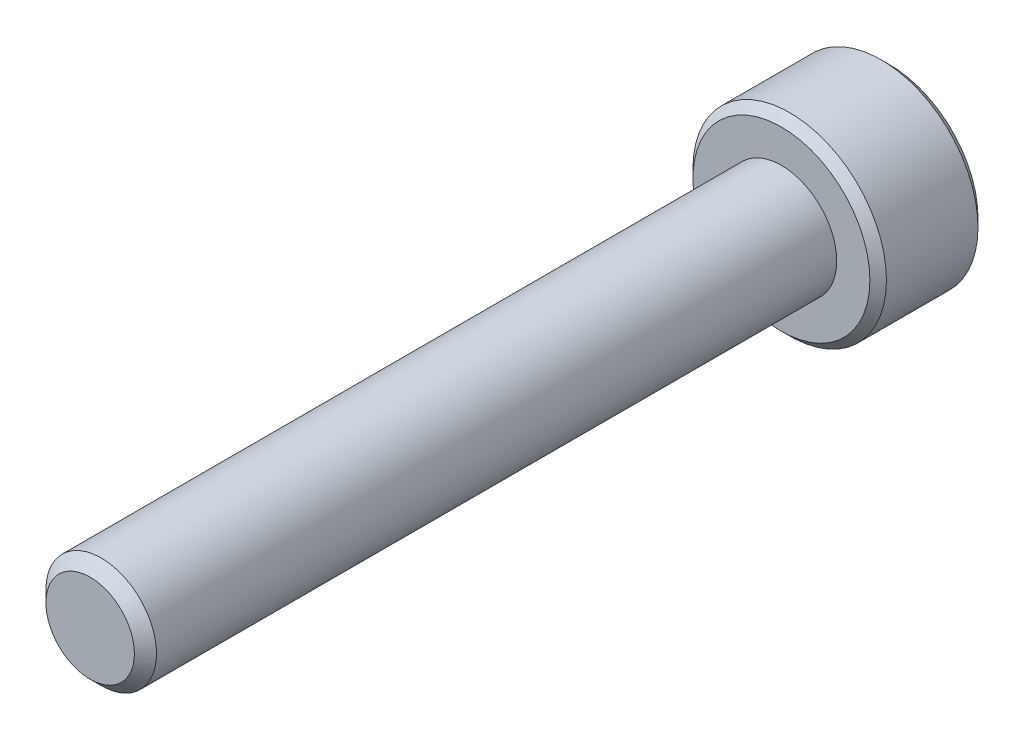
ISO-10303-21;
HEADER;
FILE_DESCRIPTION(('STEP AP214'),'2;1');
FILE_NAME('part.step','',(''),(''),'','','');
FILE_SCHEMA(('AUTOMOTIVE_DESIGN { 1 0 10303 214 1 1 1 1 }'));
ENDSEC;
DATA;
#1=APPLICATION_CONTEXT('core data for automotive mechanical design processes');
#2=APPLICATION_PROTOCOL_DEFINITION('international standard','automotive_design',2000,#1);
#3=PRODUCT_CONTEXT('',#1,'mechanical');
#4=PRODUCT('Part','Part','',(#3));
#5=PRODUCT_RELATED_PRODUCT_CATEGORY('part','',(#4));
#6=PRODUCT_DEFINITION_FORMATION('','',#4);
#7=PRODUCT_DEFINITION_CONTEXT('part definition',#1,'design');
#8=PRODUCT_DEFINITION('design','',#6,#7);
#9=PRODUCT_DEFINITION_SHAPE('','',#8);
#10=(LENGTH_UNIT() NAMED_UNIT(*) SI_UNIT(.MILLI.,.METRE.));
#11=(NAMED_UNIT(*) PLANE_ANGLE_UNIT() SI_UNIT($,.RADIAN.));
#12=(NAMED_UNIT(*) SI_UNIT($,.STERADIAN.) SOLID_ANGLE_UNIT());
#13=UNCERTAINTY_MEASURE_WITH_UNIT(LENGTH_MEASURE(1.E-05),#10,'distance_accuracy_value','');
#14=(GEOMETRIC_REPRESENTATION_CONTEXT(3) GLOBAL_UNCERTAINTY_ASSIGNED_CONTEXT((#13)) GLOBAL_UNIT_ASSIGNED_CONTEXT((#10,
#11,#12)) REPRESENTATION_CONTEXT('',''));
#15=CARTESIAN_POINT('',(0.,0.,0.));
#16=DIRECTION('',(0.,0.,1.));
#17=DIRECTION('',(1.,0.,0.));
#18=AXIS2_PLACEMENT_3D('',#15,#16,#17);
#19=CARTESIAN_POINT('',(0.,0.,3.91));
#20=DIRECTION('',(0.,0.,-1.));
#21=DIRECTION('',(-1.,0.,0.));
#22=AXIS2_PLACEMENT_3D('',#19,#20,#21);
#23=CYLINDRICAL_SURFACE('',#22,3.5);
#24=CARTESIAN_POINT('',(0.,0.,3.61));
#25=DIRECTION('',(0.,0.,1.));
#26=DIRECTION('',(1.,0.,0.));
#27=AXIS2_PLACEMENT_3D('',#24,#25,#26);
#28=CIRCLE('',#27,3.5);
#29=CARTESIAN_POINT('',(3.5,0.,3.61));
#30=VERTEX_POINT('',#29);
#31=EDGE_CURVE('E46',#30,#30,#28,.F.);
#32=ORIENTED_EDGE('',*,*,#31,.T.);
#33=EDGE_LOOP('',(#32));
#34=FACE_BOUND('',#33,.T.);
#35=CARTESIAN_POINT('',(0.,0.,0.299999999999997));
#36=DIRECTION('',(0.,0.,1.));
#37=DIRECTION('',(1.,0.,0.));
#38=AXIS2_PLACEMENT_3D('',#35,#36,#37);
#39=CIRCLE('',#38,3.5);
#40=CARTESIAN_POINT('',(3.5,0.,0.299999999999997));
#41=VERTEX_POINT('',#40);
#42=EDGE_CURVE('E157',#41,#41,#39,.T.);
#43=ORIENTED_EDGE('',*,*,#42,.T.);
#44=EDGE_LOOP('',(#43));
#45=FACE_BOUND('',#44,.T.);
#46=ADVANCED_FACE('F37',(#34,#45),#23,.T.);
#47=CARTESIAN_POINT('',(0.,0.,3.91));
#48=DIRECTION('',(0.,0.,1.));
#49=DIRECTION('',(1.,0.,0.));
#50=AXIS2_PLACEMENT_3D('',#47,#48,#49);
#51=PLANE('',#50);
#52=CARTESIAN_POINT('',(0.,0.,3.91));
#53=DIRECTION('',(0.,0.,1.));
#54=DIRECTION('',(1.,0.,0.));
#55=AXIS2_PLACEMENT_3D('',#52,#53,#54);
#56=CIRCLE('',#55,3.2);
#57=CARTESIAN_POINT('',(3.2,0.,3.91));
#58=VERTEX_POINT('',#57);
#59=EDGE_CURVE('E154',#58,#58,#56,.T.);
#60=ORIENTED_EDGE('',*,*,#59,.T.);
#61=EDGE_LOOP('',(#60));
#62=FACE_BOUND('',#61,.T.);
#63=CARTESIAN_POINT('',(0.,0.,3.91));
#64=DIRECTION('',(0.,0.,1.));
#65=DIRECTION('',(1.,0.,0.));
#66=AXIS2_PLACEMENT_3D('',#63,#64,#65);
#67=CIRCLE('',#66,2.);
#68=CARTESIAN_POINT('',(2.,0.,3.91));
#69=VERTEX_POINT('',#68);
#70=EDGE_CURVE('E140',#69,#69,#67,.T.);
#71=ORIENTED_EDGE('',*,*,#70,.F.);
#72=EDGE_LOOP('',(#71));
#73=FACE_BOUND('',#72,.T.);
#74=ADVANCED_FACE('F170',(#62,#73),#51,.T.);
#75=CARTESIAN_POINT('',(0.,0.,0.));
#76=DIRECTION('',(0.,0.,1.));
#77=DIRECTION('',(1.,0.,0.));
#78=AXIS2_PLACEMENT_3D('',#75,#76,#77);
#79=PLANE('',#78);
#80=CARTESIAN_POINT('',(0.,0.,0.));
#81=DIRECTION('',(0.,0.,1.));
#82=DIRECTION('',(1.,0.,0.));
#83=AXIS2_PLACEMENT_3D('',#80,#81,#82);
#84=CIRCLE('',#83,3.2);
#85=CARTESIAN_POINT('',(3.2,0.,0.));
#86=VERTEX_POINT('',#85);
#87=EDGE_CURVE('E11',#86,#86,#84,.F.);
#88=ORIENTED_EDGE('',*,*,#87,.T.);
#89=EDGE_LOOP('',(#88));
#90=FACE_BOUND('',#89,.T.);
#91=DIRECTION('',(0.866025403784439,-0.5,0.));
#92=VECTOR('',#91,1.);
#93=CARTESIAN_POINT('',(0.,1.76091832102836,0.));
#94=LINE('',#93,#92);
#95=CARTESIAN_POINT('',(0.,1.76091832102836,0.));
#96=VERTEX_POINT('',#95);
#97=CARTESIAN_POINT('',(1.525,0.88045916051418,0.));
#98=VERTEX_POINT('',#97);
#99=EDGE_CURVE('E127',#96,#98,#94,.T.);
#100=ORIENTED_EDGE('',*,*,#99,.F.);
#101=DIRECTION('',(0.866025403784439,0.5,0.));
#102=VECTOR('',#101,1.);
#103=CARTESIAN_POINT('',(-1.525,0.880459160514179,0.));
#104=LINE('',#103,#102);
#105=CARTESIAN_POINT('',(-1.525,0.880459160514179,0.));
#106=VERTEX_POINT('',#105);
#107=EDGE_CURVE('E53',#106,#96,#104,.T.);
#108=ORIENTED_EDGE('',*,*,#107,.F.);
#109=DIRECTION('',(0.,1.,0.));
#110=VECTOR('',#109,1.);
#111=CARTESIAN_POINT('',(-1.525,-0.88045916051418,0.));
#112=LINE('',#111,#110);
#113=CARTESIAN_POINT('',(-1.525,-0.88045916051418,0.));
#114=VERTEX_POINT('',#113);
#115=EDGE_CURVE('E136',#114,#106,#112,.T.);
#116=ORIENTED_EDGE('',*,*,#115,.F.);
#117=DIRECTION('',(-0.866025403784439,0.5,0.));
#118=VECTOR('',#117,1.);
#119=CARTESIAN_POINT('',(0.,-1.76091832102836,0.));
#120=LINE('',#119,#118);
#121=CARTESIAN_POINT('',(0.,-1.76091832102836,0.));
#122=VERTEX_POINT('',#121);
#123=EDGE_CURVE('E134',#122,#114,#120,.T.);
#124=ORIENTED_EDGE('',*,*,#123,.F.);
#125=DIRECTION('',(-0.866025403784438,-0.5,0.));
#126=VECTOR('',#125,1.);
#127=CARTESIAN_POINT('',(1.525,-0.880459160514179,0.));
#128=LINE('',#127,#126);
#129=CARTESIAN_POINT('',(1.525,-0.880459160514179,0.));
#130=VERTEX_POINT('',#129);
#131=EDGE_CURVE('E101',#130,#122,#128,.T.);
#132=ORIENTED_EDGE('',*,*,#131,.F.);
#133=DIRECTION('',(0.,-1.,0.));
#134=VECTOR('',#133,1.);
#135=CARTESIAN_POINT('',(1.525,0.88045916051418,0.));
#136=LINE('',#135,#134);
#137=EDGE_CURVE('E130',#98,#130,#136,.T.);
#138=ORIENTED_EDGE('',*,*,#137,.F.);
#139=EDGE_LOOP('',(#100,#108,#116,#124,#132,#138));
#140=FACE_BOUND('',#139,.T.);
#141=ADVANCED_FACE('F173',(#90,#140),#79,.F.);
#142=CARTESIAN_POINT('',(0.,0.,28.91));
#143=DIRECTION('',(0.,0.,-1.));
#144=DIRECTION('',(-1.,0.,0.));
#145=AXIS2_PLACEMENT_3D('',#142,#143,#144);
#146=CYLINDRICAL_SURFACE('',#145,2.);
#147=CARTESIAN_POINT('',(0.,0.,28.51));
#148=DIRECTION('',(0.,0.,1.));
#149=DIRECTION('',(1.,0.,0.));
#150=AXIS2_PLACEMENT_3D('',#147,#148,#149);
#151=CIRCLE('',#150,2.);
#152=CARTESIAN_POINT('',(2.,0.,28.51));
#153=VERTEX_POINT('',#152);
#154=EDGE_CURVE('E151',#153,#153,#151,.F.);
#155=ORIENTED_EDGE('',*,*,#154,.T.);
#156=EDGE_LOOP('',(#155));
#157=FACE_BOUND('',#156,.T.);
#158=ORIENTED_EDGE('',*,*,#70,.T.);
#159=EDGE_LOOP('',(#158));
#160=FACE_BOUND('',#159,.T.);
#161=ADVANCED_FACE('F177',(#157,#160),#146,.T.);
#162=CARTESIAN_POINT('',(0.,0.,28.91));
#163=DIRECTION('',(0.,0.,1.));
#164=DIRECTION('',(1.,0.,0.));
#165=AXIS2_PLACEMENT_3D('',#162,#163,#164);
#166=PLANE('',#165);
#167=CARTESIAN_POINT('',(0.,0.,28.91));
#168=DIRECTION('',(0.,0.,1.));
#169=DIRECTION('',(1.,0.,0.));
#170=AXIS2_PLACEMENT_3D('',#167,#168,#169);
#171=CIRCLE('',#170,1.6);
#172=CARTESIAN_POINT('',(1.6,0.,28.91));
#173=VERTEX_POINT('',#172);
#174=EDGE_CURVE('E148',#173,#173,#171,.T.);
#175=ORIENTED_EDGE('',*,*,#174,.T.);
#176=EDGE_LOOP('',(#175));
#177=FACE_BOUND('',#176,.T.);
#178=ADVANCED_FACE('F179',(#177),#166,.T.);
#179=CARTESIAN_POINT('',(-1.525,0.880459160514179,2.));
#180=DIRECTION('',(-0.5,0.866025403784439,0.));
#181=DIRECTION('',(-0.866025403784439,-0.5,0.));
#182=AXIS2_PLACEMENT_3D('',#179,#180,#181);
#183=PLANE('',#182);
#184=ORIENTED_EDGE('',*,*,#107,.T.);
#185=DIRECTION('',(0.,0.,-1.));
#186=VECTOR('',#185,1.);
#187=CARTESIAN_POINT('',(0.,1.76091832102836,2.));
#188=LINE('',#187,#186);
#189=CARTESIAN_POINT('',(0.,1.76091832102836,2.));
#190=VERTEX_POINT('',#189);
#191=EDGE_CURVE('E83',#190,#96,#188,.T.);
#192=ORIENTED_EDGE('',*,*,#191,.F.);
#193=DIRECTION('',(0.866025403784439,0.5,0.));
#194=VECTOR('',#193,1.);
#195=CARTESIAN_POINT('',(-1.525,0.880459160514179,2.));
#196=LINE('',#195,#194);
#197=CARTESIAN_POINT('',(-1.525,0.880459160514179,2.));
#198=VERTEX_POINT('',#197);
#199=EDGE_CURVE('E138',#198,#190,#196,.T.);
#200=ORIENTED_EDGE('',*,*,#199,.F.);
#201=DIRECTION('',(0.,0.,-1.));
#202=VECTOR('',#201,1.);
#203=CARTESIAN_POINT('',(-1.525,0.880459160514179,2.));
#204=LINE('',#203,#202);
#205=EDGE_CURVE('E61',#198,#106,#204,.T.);
#206=ORIENTED_EDGE('',*,*,#205,.T.);
#207=EDGE_LOOP('',(#184,#192,#200,#206));
#208=FACE_BOUND('',#207,.T.);
#209=ADVANCED_FACE('F186',(#208),#183,.F.);
#210=CARTESIAN_POINT('',(-1.525,-0.88045916051418,2.));
#211=DIRECTION('',(-1.,0.,0.));
#212=DIRECTION('',(0.,0.,1.));
#213=AXIS2_PLACEMENT_3D('',#210,#211,#212);
#214=PLANE('',#213);
#215=ORIENTED_EDGE('',*,*,#115,.T.);
#216=ORIENTED_EDGE('',*,*,#205,.F.);
#217=DIRECTION('',(0.,1.,0.));
#218=VECTOR('',#217,1.);
#219=CARTESIAN_POINT('',(-1.525,-0.88045916051418,2.));
#220=LINE('',#219,#218);
#221=CARTESIAN_POINT('',(-1.525,-0.88045916051418,2.));
#222=VERTEX_POINT('',#221);
#223=EDGE_CURVE('E113',#222,#198,#220,.T.);
#224=ORIENTED_EDGE('',*,*,#223,.F.);
#225=DIRECTION('',(0.,0.,-1.));
#226=VECTOR('',#225,1.);
#227=CARTESIAN_POINT('',(-1.525,-0.88045916051418,2.));
#228=LINE('',#227,#226);
#229=EDGE_CURVE('E105',#222,#114,#228,.T.);
#230=ORIENTED_EDGE('',*,*,#229,.T.);
#231=EDGE_LOOP('',(#215,#216,#224,#230));
#232=FACE_BOUND('',#231,.T.);
#233=ADVANCED_FACE('F221',(#232),#214,.F.);
#234=CARTESIAN_POINT('',(0.,-1.76091832102836,2.));
#235=DIRECTION('',(-0.5,-0.866025403784439,0.));
#236=DIRECTION('',(0.866025403784439,-0.5,0.));
#237=AXIS2_PLACEMENT_3D('',#234,#235,#236);
#238=PLANE('',#237);
#239=ORIENTED_EDGE('',*,*,#123,.T.);
#240=ORIENTED_EDGE('',*,*,#229,.F.);
#241=DIRECTION('',(-0.866025403784439,0.5,0.));
#242=VECTOR('',#241,1.);
#243=CARTESIAN_POINT('',(0.,-1.76091832102836,2.));
#244=LINE('',#243,#242);
#245=CARTESIAN_POINT('',(0.,-1.76091832102836,2.));
#246=VERTEX_POINT('',#245);
#247=EDGE_CURVE('E109',#246,#222,#244,.T.);
#248=ORIENTED_EDGE('',*,*,#247,.F.);
#249=DIRECTION('',(0.,0.,-1.));
#250=VECTOR('',#249,1.);
#251=CARTESIAN_POINT('',(0.,-1.76091832102836,2.));
#252=LINE('',#251,#250);
#253=EDGE_CURVE('E94',#246,#122,#252,.T.);
#254=ORIENTED_EDGE('',*,*,#253,.T.);
#255=EDGE_LOOP('',(#239,#240,#248,#254));
#256=FACE_BOUND('',#255,.T.);
#257=ADVANCED_FACE('F110',(#256),#238,.F.);
#258=CARTESIAN_POINT('',(1.525,-0.880459160514179,2.));
#259=DIRECTION('',(0.5,-0.866025403784439,0.));
#260=DIRECTION('',(0.866025403784438,0.5,0.));
#261=AXIS2_PLACEMENT_3D('',#258,#259,#260);
#262=PLANE('',#261);
#263=ORIENTED_EDGE('',*,*,#131,.T.);
#264=ORIENTED_EDGE('',*,*,#253,.F.);
#265=DIRECTION('',(-0.866025403784438,-0.5,0.));
#266=VECTOR('',#265,1.);
#267=CARTESIAN_POINT('',(1.525,-0.880459160514179,2.));
#268=LINE('',#267,#266);
#269=CARTESIAN_POINT('',(1.525,-0.880459160514179,2.));
#270=VERTEX_POINT('',#269);
#271=EDGE_CURVE('E98',#270,#246,#268,.T.);
#272=ORIENTED_EDGE('',*,*,#271,.F.);
#273=DIRECTION('',(0.,0.,-1.));
#274=VECTOR('',#273,1.);
#275=CARTESIAN_POINT('',(1.525,-0.880459160514179,2.));
#276=LINE('',#275,#274);
#277=EDGE_CURVE('E106',#270,#130,#276,.T.);
#278=ORIENTED_EDGE('',*,*,#277,.T.);
#279=EDGE_LOOP('',(#263,#264,#272,#278));
#280=FACE_BOUND('',#279,.T.);
#281=ADVANCED_FACE('F96',(#280),#262,.F.);
#282=CARTESIAN_POINT('',(1.525,0.88045916051418,2.));
#283=DIRECTION('',(1.,0.,0.));
#284=DIRECTION('',(0.,0.,-1.));
#285=AXIS2_PLACEMENT_3D('',#282,#283,#284);
#286=PLANE('',#285);
#287=ORIENTED_EDGE('',*,*,#137,.T.);
#288=ORIENTED_EDGE('',*,*,#277,.F.);
#289=DIRECTION('',(0.,-1.,0.));
#290=VECTOR('',#289,1.);
#291=CARTESIAN_POINT('',(1.525,0.88045916051418,2.));
#292=LINE('',#291,#290);
#293=CARTESIAN_POINT('',(1.525,0.88045916051418,2.));
#294=VERTEX_POINT('',#293);
#295=EDGE_CURVE('E119',#294,#270,#292,.T.);
#296=ORIENTED_EDGE('',*,*,#295,.F.);
#297=DIRECTION('',(0.,0.,-1.));
#298=VECTOR('',#297,1.);
#299=CARTESIAN_POINT('',(1.525,0.88045916051418,2.));
#300=LINE('',#299,#298);
#301=EDGE_CURVE('E143',#294,#98,#300,.T.);
#302=ORIENTED_EDGE('',*,*,#301,.T.);
#303=EDGE_LOOP('',(#287,#288,#296,#302));
#304=FACE_BOUND('',#303,.T.);
#305=ADVANCED_FACE('F217',(#304),#286,.F.);
#306=CARTESIAN_POINT('',(0.,1.76091832102836,2.));
#307=DIRECTION('',(0.5,0.866025403784439,0.));
#308=DIRECTION('',(-0.866025403784439,0.5,0.));
#309=AXIS2_PLACEMENT_3D('',#306,#307,#308);
#310=PLANE('',#309);
#311=ORIENTED_EDGE('',*,*,#99,.T.);
#312=ORIENTED_EDGE('',*,*,#301,.F.);
#313=DIRECTION('',(0.866025403784439,-0.5,0.));
#314=VECTOR('',#313,1.);
#315=CARTESIAN_POINT('',(0.,1.76091832102836,2.));
#316=LINE('',#315,#314);
#317=EDGE_CURVE('E121',#190,#294,#316,.T.);
#318=ORIENTED_EDGE('',*,*,#317,.F.);
#319=ORIENTED_EDGE('',*,*,#191,.T.);
#320=EDGE_LOOP('',(#311,#312,#318,#319));
#321=FACE_BOUND('',#320,.T.);
#322=ADVANCED_FACE('F209',(#321),#310,.F.);
#323=CARTESIAN_POINT('',(0.,0.,2.));
#324=DIRECTION('',(0.,0.,-1.));
#325=DIRECTION('',(-1.,0.,0.));
#326=AXIS2_PLACEMENT_3D('',#323,#324,#325);
#327=PLANE('',#326);
#328=ORIENTED_EDGE('',*,*,#199,.T.);
#329=ORIENTED_EDGE('',*,*,#317,.T.);
#330=ORIENTED_EDGE('',*,*,#295,.T.);
#331=ORIENTED_EDGE('',*,*,#271,.T.);
#332=ORIENTED_EDGE('',*,*,#247,.T.);
#333=ORIENTED_EDGE('',*,*,#223,.T.);
#334=EDGE_LOOP('',(#328,#329,#330,#331,#332,#333));
#335=FACE_BOUND('',#334,.T.);
#336=ADVANCED_FACE('F116',(#335),#327,.T.);
#337=CARTESIAN_POINT('',(0.,0.,28.91));
#338=DIRECTION('',(0.,0.,-1.));
#339=DIRECTION('',(-1.,0.,0.));
#340=AXIS2_PLACEMENT_3D('',#337,#338,#339);
#341=CONICAL_SURFACE('',#340,1.6,0.785398163397446);
#342=ORIENTED_EDGE('',*,*,#154,.F.);
#343=EDGE_LOOP('',(#342));
#344=FACE_BOUND('',#343,.T.);
#345=ORIENTED_EDGE('',*,*,#174,.F.);
#346=EDGE_LOOP('',(#345));
#347=FACE_BOUND('',#346,.T.);
#348=ADVANCED_FACE('F167',(#344,#347),#341,.T.);
#349=CARTESIAN_POINT('',(0.,0.,3.91));
#350=DIRECTION('',(0.,0.,-1.));
#351=DIRECTION('',(-1.,0.,0.));
#352=AXIS2_PLACEMENT_3D('',#349,#350,#351);
#353=CONICAL_SURFACE('',#352,3.2,0.785398163397447);
#354=ORIENTED_EDGE('',*,*,#31,.F.);
#355=EDGE_LOOP('',(#354));
#356=FACE_BOUND('',#355,.T.);
#357=ORIENTED_EDGE('',*,*,#59,.F.);
#358=EDGE_LOOP('',(#357));
#359=FACE_BOUND('',#358,.T.);
#360=ADVANCED_FACE('F164',(#356,#359),#353,.T.);
#361=CARTESIAN_POINT('',(0.,0.,0.299999999999997));
#362=DIRECTION('',(0.,0.,1.));
#363=DIRECTION('',(1.,0.,0.));
#364=AXIS2_PLACEMENT_3D('',#361,#362,#363);
#365=CONICAL_SURFACE('',#364,3.5,0.785398163397457);
#366=ORIENTED_EDGE('',*,*,#87,.F.);
#367=EDGE_LOOP('',(#366));
#368=FACE_BOUND('',#367,.T.);
#369=ORIENTED_EDGE('',*,*,#42,.F.);
#370=EDGE_LOOP('',(#369));
#371=FACE_BOUND('',#370,.T.);
#372=ADVANCED_FACE('F40',(#368,#371),#365,.T.);
#373=CLOSED_SHELL('',(#46,#74,#141,#161,#178,#209,#233,#257,#281,#305,#322,#336,#348,#360,#372));
#374=MANIFOLD_SOLID_BREP('B2',#373);
#375=ADVANCED_BREP_SHAPE_REPRESENTATION('',(#18,#374),#14);
#376=SHAPE_DEFINITION_REPRESENTATION(#9,#375);
ENDSEC;
END-ISO-10303-21;
